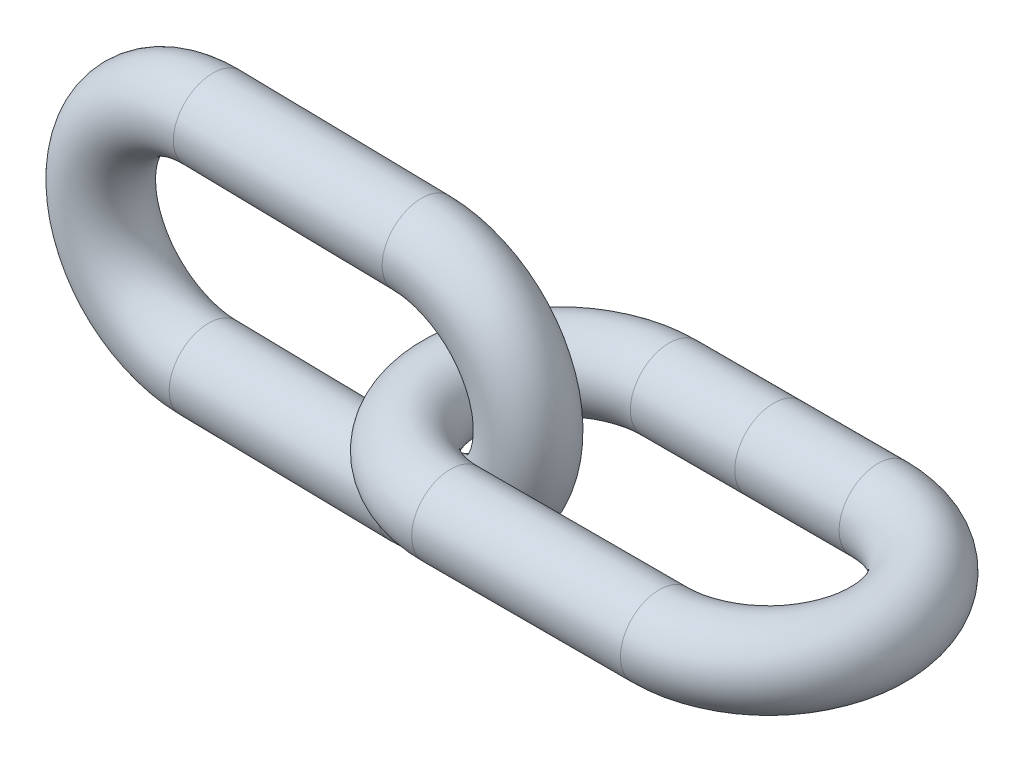
ISO-10303-21;
HEADER;
FILE_DESCRIPTION(('STEP AP214'),'2;1');
FILE_NAME('part.step','',(''),(''),'','','');
FILE_SCHEMA(('AUTOMOTIVE_DESIGN { 1 0 10303 214 1 1 1 1 }'));
ENDSEC;
DATA;
#1=APPLICATION_CONTEXT('core data for automotive mechanical design processes');
#2=APPLICATION_PROTOCOL_DEFINITION('international standard','automotive_design',2000,#1);
#3=PRODUCT_CONTEXT('',#1,'mechanical');
#4=PRODUCT('Part','Part','',(#3));
#5=PRODUCT_RELATED_PRODUCT_CATEGORY('part','',(#4));
#6=PRODUCT_DEFINITION_FORMATION('','',#4);
#7=PRODUCT_DEFINITION_CONTEXT('part definition',#1,'design');
#8=PRODUCT_DEFINITION('design','',#6,#7);
#9=PRODUCT_DEFINITION_SHAPE('','',#8);
#10=(LENGTH_UNIT() NAMED_UNIT(*) SI_UNIT(.MILLI.,.METRE.));
#11=(NAMED_UNIT(*) PLANE_ANGLE_UNIT() SI_UNIT($,.RADIAN.));
#12=(NAMED_UNIT(*) SI_UNIT($,.STERADIAN.) SOLID_ANGLE_UNIT());
#13=UNCERTAINTY_MEASURE_WITH_UNIT(LENGTH_MEASURE(1.E-05),#10,'distance_accuracy_value','');
#14=(GEOMETRIC_REPRESENTATION_CONTEXT(3) GLOBAL_UNCERTAINTY_ASSIGNED_CONTEXT((#13)) GLOBAL_UNIT_ASSIGNED_CONTEXT((#10,
#11,#12)) REPRESENTATION_CONTEXT('',''));
#15=CARTESIAN_POINT('',(0.,0.,0.));
#16=DIRECTION('',(0.,0.,1.));
#17=DIRECTION('',(1.,0.,0.));
#18=AXIS2_PLACEMENT_3D('',#15,#16,#17);
#19=CARTESIAN_POINT('',(-22.0941556142389,0.148175185085614,0.));
#20=DIRECTION('',(0.,0.,-1.));
#21=DIRECTION('',(-1.,0.,0.));
#22=AXIS2_PLACEMENT_3D('',#19,#20,#21);
#23=TOROIDAL_SURFACE('',#22,9.84250000000012,3.4925);
#24=CARTESIAN_POINT('',(-21.9060267454579,9.98887707970337,0.));
#25=DIRECTION('',(-0.999817312127776,0.0191139312960121,0.));
#26=DIRECTION('',(-0.0191139312960121,-0.999817312127776,0.));
#27=AXIS2_PLACEMENT_3D('',#24,#25,#26);
#28=CIRCLE('',#27,3.4925);
#29=CARTESIAN_POINT('',(-21.8392713404066,13.4807390423096,0.));
#30=VERTEX_POINT('',#29);
#31=EDGE_CURVE('E53',#30,#30,#28,.T.);
#32=CARTESIAN_POINT('',(-22.2822844830199,-9.69252670953214,0.));
#33=DIRECTION('',(0.999817312127776,-0.0191139312960121,0.));
#34=DIRECTION('',(0.0191139312960121,0.999817312127776,0.));
#35=AXIS2_PLACEMENT_3D('',#32,#33,#34);
#36=CIRCLE('',#35,3.4925);
#37=CARTESIAN_POINT('',(-22.3490398880712,-13.1843886721384,0.));
#38=VERTEX_POINT('',#37);
#39=EDGE_CURVE('E49',#38,#38,#36,.T.);
#40=CARTESIAN_POINT('',(-22.0941556142389,0.148175185085614,0.));
#41=DIRECTION('',(0.,0.,-1.));
#42=DIRECTION('',(-1.,0.,0.));
#43=AXIS2_PLACEMENT_3D('',#40,#41,#42);
#44=CIRCLE('',#43,13.3350000000001);
#45=EDGE_CURVE('',#30,#38,#44,.T.);
#46=ORIENTED_EDGE('',*,*,#31,.F.);
#47=ORIENTED_EDGE('',*,*,#39,.T.);
#48=ORIENTED_EDGE('',*,*,#45,.T.);
#49=ORIENTED_EDGE('',*,*,#45,.F.);
#50=EDGE_LOOP('',(#46,#48,#47,#49));
#51=FACE_BOUND('',#50,.T.);
#52=ADVANCED_FACE('F38',(#51),#23,.T.);
#53=CARTESIAN_POINT('',(-22.2822844830199,-9.6925267095321,0.));
#54=DIRECTION('',(-0.999817312127776,0.0191139312960121,0.));
#55=DIRECTION('',(-0.0191139312960121,-0.999817312127776,0.));
#56=AXIS2_PLACEMENT_3D('',#53,#54,#55);
#57=CYLINDRICAL_SURFACE('',#56,3.4925);
#58=CARTESIAN_POINT('',(-41.0748506817381,-9.33326125689293,0.));
#59=DIRECTION('',(0.999817312127776,-0.0191139312960124,0.));
#60=DIRECTION('',(0.0191139312960124,0.999817312127776,0.));
#61=AXIS2_PLACEMENT_3D('',#58,#59,#60);
#62=CIRCLE('',#61,3.4925);
#63=CARTESIAN_POINT('',(-41.1416060867894,-12.8251232194992,0.));
#64=VERTEX_POINT('',#63);
#65=EDGE_CURVE('E45',#64,#64,#62,.T.);
#66=ORIENTED_EDGE('',*,*,#65,.T.);
#67=EDGE_LOOP('',(#66));
#68=FACE_BOUND('',#67,.T.);
#69=ORIENTED_EDGE('',*,*,#39,.F.);
#70=EDGE_LOOP('',(#69));
#71=FACE_BOUND('',#70,.T.);
#72=ADVANCED_FACE('F62',(#68,#71),#57,.T.);
#73=CARTESIAN_POINT('',(-40.8867218129571,0.507440637724834,0.));
#74=DIRECTION('',(0.,0.,-1.));
#75=DIRECTION('',(-1.,0.,0.));
#76=AXIS2_PLACEMENT_3D('',#73,#74,#75);
#77=TOROIDAL_SURFACE('',#76,9.84250000000011,3.4925);
#78=CARTESIAN_POINT('',(-40.6985929441761,10.3481425323426,0.));
#79=DIRECTION('',(-0.999817312127776,0.0191139312960121,0.));
#80=DIRECTION('',(-0.0191139312960121,-0.999817312127776,0.));
#81=AXIS2_PLACEMENT_3D('',#78,#79,#80);
#82=CIRCLE('',#81,3.4925);
#83=CARTESIAN_POINT('',(-40.6318375391247,13.8400044949488,0.));
#84=VERTEX_POINT('',#83);
#85=EDGE_CURVE('E11',#84,#84,#82,.T.);
#86=CARTESIAN_POINT('',(-40.8867218129571,0.507440637724834,0.));
#87=DIRECTION('',(0.,0.,-1.));
#88=DIRECTION('',(-1.,0.,0.));
#89=AXIS2_PLACEMENT_3D('',#86,#87,#88);
#90=CIRCLE('',#89,13.3350000000001);
#91=EDGE_CURVE('',#64,#84,#90,.T.);
#92=ORIENTED_EDGE('',*,*,#65,.F.);
#93=ORIENTED_EDGE('',*,*,#85,.T.);
#94=ORIENTED_EDGE('',*,*,#91,.T.);
#95=ORIENTED_EDGE('',*,*,#91,.F.);
#96=EDGE_LOOP('',(#92,#94,#93,#95));
#97=FACE_BOUND('',#96,.T.);
#98=ADVANCED_FACE('F68',(#97),#77,.T.);
#99=CARTESIAN_POINT('',(-40.6985929441761,10.3481425323426,0.));
#100=DIRECTION('',(0.999817312127776,-0.0191139312960121,0.));
#101=DIRECTION('',(0.0191139312960121,0.999817312127776,0.));
#102=AXIS2_PLACEMENT_3D('',#99,#100,#101);
#103=CYLINDRICAL_SURFACE('',#102,3.4925);
#104=ORIENTED_EDGE('',*,*,#31,.T.);
#105=EDGE_LOOP('',(#104));
#106=FACE_BOUND('',#105,.T.);
#107=ORIENTED_EDGE('',*,*,#85,.F.);
#108=EDGE_LOOP('',(#107));
#109=FACE_BOUND('',#108,.T.);
#110=ADVANCED_FACE('F40',(#106,#109),#103,.T.);
#111=CLOSED_SHELL('',(#52,#72,#98,#110));
#112=MANIFOLD_SOLID_BREP('B2',#111);
#113=CARTESIAN_POINT('',(-9.39800000000001,0.,-9.8425));
#114=DIRECTION('',(1.,0.,0.));
#115=DIRECTION('',(0.,0.,-1.));
#116=AXIS2_PLACEMENT_3D('',#113,#114,#115);
#117=CYLINDRICAL_SURFACE('',#116,3.4925);
#118=CARTESIAN_POINT('',(0.,0.,-9.8425));
#119=DIRECTION('',(1.,0.,0.));
#120=DIRECTION('',(0.,0.,-1.));
#121=AXIS2_PLACEMENT_3D('',#118,#119,#120);
#122=CIRCLE('',#121,3.4925);
#123=CARTESIAN_POINT('',(0.,0.,-13.335));
#124=VERTEX_POINT('',#123);
#125=EDGE_CURVE('E118',#124,#124,#122,.T.);
#126=ORIENTED_EDGE('',*,*,#125,.F.);
#127=EDGE_LOOP('',(#126));
#128=FACE_BOUND('',#127,.T.);
#129=CARTESIAN_POINT('',(-9.39800000000001,0.,-9.8425));
#130=DIRECTION('',(1.,0.,0.));
#131=DIRECTION('',(0.,0.,-1.));
#132=AXIS2_PLACEMENT_3D('',#129,#130,#131);
#133=CIRCLE('',#132,3.4925);
#134=CARTESIAN_POINT('',(-9.39800000000001,0.,-13.335));
#135=VERTEX_POINT('',#134);
#136=EDGE_CURVE('E37',#135,#135,#133,.T.);
#137=ORIENTED_EDGE('',*,*,#136,.T.);
#138=EDGE_LOOP('',(#137));
#139=FACE_BOUND('',#138,.T.);
#140=ADVANCED_FACE('F99',(#128,#139),#117,.T.);
#141=CARTESIAN_POINT('',(-9.39800000000001,0.,0.));
#142=DIRECTION('',(0.,-1.,0.));
#143=DIRECTION('',(0.,0.,-1.));
#144=AXIS2_PLACEMENT_3D('',#141,#142,#143);
#145=TOROIDAL_SURFACE('',#144,9.8425,3.4925);
#146=CARTESIAN_POINT('',(-9.39800000000001,0.,9.84250000000001));
#147=DIRECTION('',(-1.,0.,0.));
#148=DIRECTION('',(0.,0.,1.));
#149=AXIS2_PLACEMENT_3D('',#146,#147,#148);
#150=CIRCLE('',#149,3.4925);
#151=CARTESIAN_POINT('',(-9.39800000000001,0.,13.335));
#152=VERTEX_POINT('',#151);
#153=EDGE_CURVE('E105',#152,#152,#150,.T.);
#154=CARTESIAN_POINT('',(-9.39800000000001,0.,0.));
#155=DIRECTION('',(0.,-1.,0.));
#156=DIRECTION('',(0.,0.,-1.));
#157=AXIS2_PLACEMENT_3D('',#154,#155,#156);
#158=CIRCLE('',#157,13.335);
#159=EDGE_CURVE('',#152,#135,#158,.T.);
#160=ORIENTED_EDGE('',*,*,#153,.T.);
#161=ORIENTED_EDGE('',*,*,#136,.F.);
#162=ORIENTED_EDGE('',*,*,#159,.T.);
#163=ORIENTED_EDGE('',*,*,#159,.F.);
#164=EDGE_LOOP('',(#160,#162,#161,#163));
#165=FACE_BOUND('',#164,.T.);
#166=ADVANCED_FACE('F125',(#165),#145,.T.);
#167=CARTESIAN_POINT('',(9.39800000000002,0.,9.84250000000001));
#168=DIRECTION('',(-1.,0.,0.));
#169=DIRECTION('',(0.,0.,1.));
#170=AXIS2_PLACEMENT_3D('',#167,#168,#169);
#171=CYLINDRICAL_SURFACE('',#170,3.4925);
#172=ORIENTED_EDGE('',*,*,#153,.F.);
#173=EDGE_LOOP('',(#172));
#174=FACE_BOUND('',#173,.T.);
#175=CARTESIAN_POINT('',(9.39800000000001,0.,9.8425));
#176=DIRECTION('',(-1.,0.,0.));
#177=DIRECTION('',(0.,0.,1.));
#178=AXIS2_PLACEMENT_3D('',#175,#176,#177);
#179=CIRCLE('',#178,3.4925);
#180=CARTESIAN_POINT('',(9.39800000000001,0.,13.335));
#181=VERTEX_POINT('',#180);
#182=EDGE_CURVE('E109',#181,#181,#179,.T.);
#183=ORIENTED_EDGE('',*,*,#182,.T.);
#184=EDGE_LOOP('',(#183));
#185=FACE_BOUND('',#184,.T.);
#186=ADVANCED_FACE('F129',(#174,#185),#171,.T.);
#187=CARTESIAN_POINT('',(9.39800000000001,0.,0.));
#188=DIRECTION('',(0.,-1.,0.));
#189=DIRECTION('',(0.,0.,-1.));
#190=AXIS2_PLACEMENT_3D('',#187,#188,#189);
#191=TOROIDAL_SURFACE('',#190,9.8425,3.4925);
#192=CARTESIAN_POINT('',(9.39800000000002,0.,-9.8425));
#193=DIRECTION('',(1.,0.,0.));
#194=DIRECTION('',(0.,0.,-1.));
#195=AXIS2_PLACEMENT_3D('',#192,#193,#194);
#196=CIRCLE('',#195,3.4925);
#197=CARTESIAN_POINT('',(9.39800000000002,0.,-13.335));
#198=VERTEX_POINT('',#197);
#199=EDGE_CURVE('E113',#198,#198,#196,.T.);
#200=CARTESIAN_POINT('',(9.39800000000001,0.,0.));
#201=DIRECTION('',(0.,-1.,0.));
#202=DIRECTION('',(0.,0.,-1.));
#203=AXIS2_PLACEMENT_3D('',#200,#201,#202);
#204=CIRCLE('',#203,13.335);
#205=EDGE_CURVE('',#198,#181,#204,.T.);
#206=ORIENTED_EDGE('',*,*,#199,.T.);
#207=ORIENTED_EDGE('',*,*,#182,.F.);
#208=ORIENTED_EDGE('',*,*,#205,.T.);
#209=ORIENTED_EDGE('',*,*,#205,.F.);
#210=EDGE_LOOP('',(#206,#208,#207,#209));
#211=FACE_BOUND('',#210,.T.);
#212=ADVANCED_FACE('F134',(#211),#191,.T.);
#213=CARTESIAN_POINT('',(0.,0.,-9.8425));
#214=DIRECTION('',(1.,0.,0.));
#215=DIRECTION('',(0.,0.,-1.));
#216=AXIS2_PLACEMENT_3D('',#213,#214,#215);
#217=CYLINDRICAL_SURFACE('',#216,3.4925);
#218=ORIENTED_EDGE('',*,*,#199,.F.);
#219=EDGE_LOOP('',(#218));
#220=FACE_BOUND('',#219,.T.);
#221=ORIENTED_EDGE('',*,*,#125,.T.);
#222=EDGE_LOOP('',(#221));
#223=FACE_BOUND('',#222,.T.);
#224=ADVANCED_FACE('F122',(#220,#223),#217,.T.);
#225=CLOSED_SHELL('',(#140,#166,#186,#212,#224));
#226=MANIFOLD_SOLID_BREP('B6',#225);
#227=ADVANCED_BREP_SHAPE_REPRESENTATION('',(#18,#112,#226),#14);
#228=SHAPE_DEFINITION_REPRESENTATION(#9,#227);
ENDSEC;
END-ISO-10303-21;
